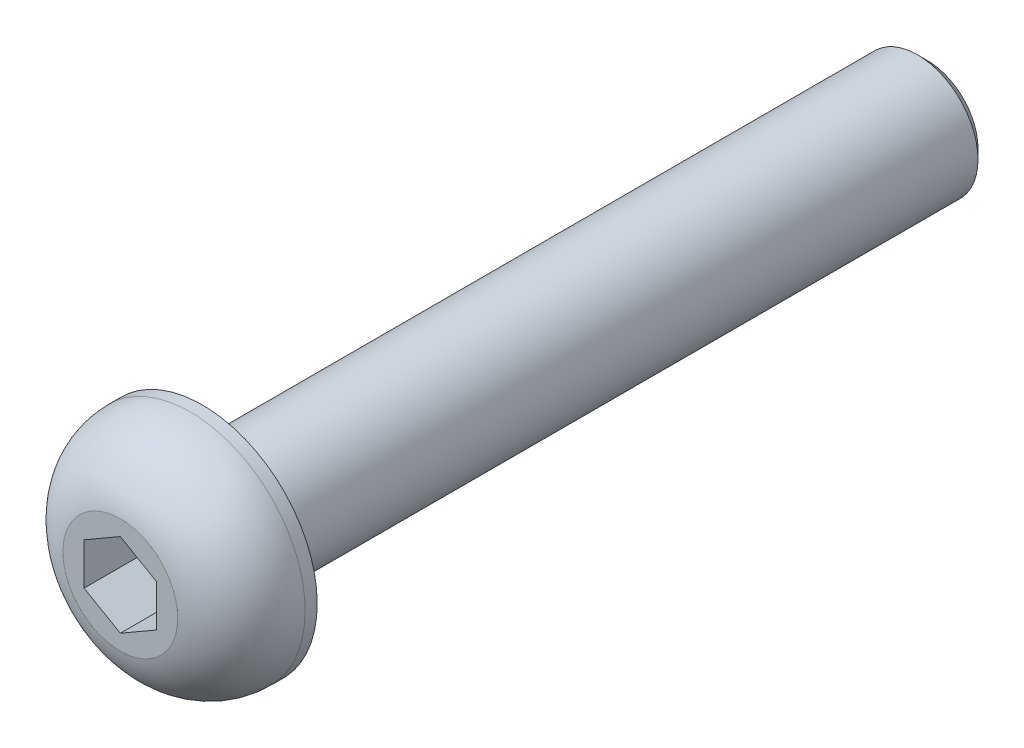
ISO-10303-21;
HEADER;
FILE_DESCRIPTION(('STEP AP214'),'2;1');
FILE_NAME('part.step','',(''),(''),'','','');
FILE_SCHEMA(('AUTOMOTIVE_DESIGN { 1 0 10303 214 1 1 1 1 }'));
ENDSEC;
DATA;
#1=APPLICATION_CONTEXT('core data for automotive mechanical design processes');
#2=APPLICATION_PROTOCOL_DEFINITION('international standard','automotive_design',2000,#1);
#3=PRODUCT_CONTEXT('',#1,'mechanical');
#4=PRODUCT('Part','Part','',(#3));
#5=PRODUCT_RELATED_PRODUCT_CATEGORY('part','',(#4));
#6=PRODUCT_DEFINITION_FORMATION('','',#4);
#7=PRODUCT_DEFINITION_CONTEXT('part definition',#1,'design');
#8=PRODUCT_DEFINITION('design','',#6,#7);
#9=PRODUCT_DEFINITION_SHAPE('','',#8);
#10=(LENGTH_UNIT() NAMED_UNIT(*) SI_UNIT(.MILLI.,.METRE.));
#11=(NAMED_UNIT(*) PLANE_ANGLE_UNIT() SI_UNIT($,.RADIAN.));
#12=(NAMED_UNIT(*) SI_UNIT($,.STERADIAN.) SOLID_ANGLE_UNIT());
#13=UNCERTAINTY_MEASURE_WITH_UNIT(LENGTH_MEASURE(1.E-05),#10,'distance_accuracy_value','');
#14=(GEOMETRIC_REPRESENTATION_CONTEXT(3) GLOBAL_UNCERTAINTY_ASSIGNED_CONTEXT((#13)) GLOBAL_UNIT_ASSIGNED_CONTEXT((#10,
#11,#12)) REPRESENTATION_CONTEXT('',''));
#15=CARTESIAN_POINT('',(0.,0.,0.));
#16=DIRECTION('',(0.,0.,1.));
#17=DIRECTION('',(1.,0.,0.));
#18=AXIS2_PLACEMENT_3D('',#15,#16,#17);
#19=CARTESIAN_POINT('',(0.,2.375,3.4));
#20=DIRECTION('',(0.,0.,-1.));
#21=DIRECTION('',(-1.,0.,0.));
#22=AXIS2_PLACEMENT_3D('',#19,#20,#21);
#23=PLANE('',#22);
#24=CARTESIAN_POINT('',(0.,0.,3.4));
#25=DIRECTION('',(0.,0.,1.));
#26=DIRECTION('',(1.,0.,0.));
#27=AXIS2_PLACEMENT_3D('',#24,#25,#26);
#28=CIRCLE('',#27,2.375);
#29=CARTESIAN_POINT('',(2.375,0.,3.4));
#30=VERTEX_POINT('',#29);
#31=EDGE_CURVE('E140',#30,#30,#28,.T.);
#32=ORIENTED_EDGE('',*,*,#31,.T.);
#33=EDGE_LOOP('',(#32));
#34=FACE_BOUND('',#33,.T.);
#35=DIRECTION('',(-0.866025403784439,-0.5,0.));
#36=VECTOR('',#35,1.);
#37=CARTESIAN_POINT('',(0.,1.73205080756888,3.4));
#38=LINE('',#37,#36);
#39=CARTESIAN_POINT('',(0.,1.73205080756888,3.4));
#40=VERTEX_POINT('',#39);
#41=CARTESIAN_POINT('',(-1.5,0.866025403784438,3.4));
#42=VERTEX_POINT('',#41);
#43=EDGE_CURVE('E92',#40,#42,#38,.T.);
#44=ORIENTED_EDGE('',*,*,#43,.F.);
#45=DIRECTION('',(-0.866025403784439,0.5,0.));
#46=VECTOR('',#45,1.);
#47=CARTESIAN_POINT('',(1.5,0.866025403784439,3.4));
#48=LINE('',#47,#46);
#49=CARTESIAN_POINT('',(1.5,0.866025403784439,3.4));
#50=VERTEX_POINT('',#49);
#51=EDGE_CURVE('E52',#50,#40,#48,.T.);
#52=ORIENTED_EDGE('',*,*,#51,.F.);
#53=DIRECTION('',(0.,1.,0.));
#54=VECTOR('',#53,1.);
#55=CARTESIAN_POINT('',(1.5,-0.866025403784438,3.4));
#56=LINE('',#55,#54);
#57=CARTESIAN_POINT('',(1.5,-0.866025403784438,3.4));
#58=VERTEX_POINT('',#57);
#59=EDGE_CURVE('E120',#58,#50,#56,.T.);
#60=ORIENTED_EDGE('',*,*,#59,.F.);
#61=DIRECTION('',(0.866025403784438,0.5,0.));
#62=VECTOR('',#61,1.);
#63=CARTESIAN_POINT('',(0.,-1.73205080756888,3.4));
#64=LINE('',#63,#62);
#65=CARTESIAN_POINT('',(0.,-1.73205080756888,3.4));
#66=VERTEX_POINT('',#65);
#67=EDGE_CURVE('E114',#66,#58,#64,.T.);
#68=ORIENTED_EDGE('',*,*,#67,.F.);
#69=DIRECTION('',(0.866025403784439,-0.5,0.));
#70=VECTOR('',#69,1.);
#71=CARTESIAN_POINT('',(-1.5,-0.866025403784438,3.4));
#72=LINE('',#71,#70);
#73=CARTESIAN_POINT('',(-1.5,-0.866025403784438,3.4));
#74=VERTEX_POINT('',#73);
#75=EDGE_CURVE('E112',#74,#66,#72,.T.);
#76=ORIENTED_EDGE('',*,*,#75,.F.);
#77=DIRECTION('',(0.,-1.,0.));
#78=VECTOR('',#77,1.);
#79=CARTESIAN_POINT('',(-1.5,0.866025403784438,3.4));
#80=LINE('',#79,#78);
#81=EDGE_CURVE('E100',#42,#74,#80,.T.);
#82=ORIENTED_EDGE('',*,*,#81,.F.);
#83=EDGE_LOOP('',(#44,#52,#60,#68,#76,#82));
#84=FACE_BOUND('',#83,.T.);
#85=ADVANCED_FACE('F37',(#34,#84),#23,.F.);
#86=CARTESIAN_POINT('',(0.,0.,-30.));
#87=DIRECTION('',(0.,0.,1.));
#88=DIRECTION('',(1.,0.,0.));
#89=AXIS2_PLACEMENT_3D('',#86,#87,#88);
#90=PLANE('',#89);
#91=CARTESIAN_POINT('',(0.,0.,-30.));
#92=DIRECTION('',(0.,0.,1.));
#93=DIRECTION('',(1.,0.,0.));
#94=AXIS2_PLACEMENT_3D('',#91,#92,#93);
#95=CIRCLE('',#94,2.1);
#96=CARTESIAN_POINT('',(2.1,0.,-30.));
#97=VERTEX_POINT('',#96);
#98=EDGE_CURVE('E231',#97,#97,#95,.F.);
#99=ORIENTED_EDGE('',*,*,#98,.T.);
#100=EDGE_LOOP('',(#99));
#101=FACE_BOUND('',#100,.T.);
#102=ADVANCED_FACE('F209',(#101),#90,.F.);
#103=CARTESIAN_POINT('',(0.,0.,30.8099697885196));
#104=DIRECTION('',(0.,0.,1.));
#105=DIRECTION('',(1.,0.,0.));
#106=AXIS2_PLACEMENT_3D('',#103,#104,#105);
#107=CYLINDRICAL_SURFACE('',#106,2.5);
#108=CARTESIAN_POINT('',(0.,0.,-0.199999999999999));
#109=DIRECTION('',(0.,0.,1.));
#110=DIRECTION('',(1.,0.,0.));
#111=AXIS2_PLACEMENT_3D('',#108,#109,#110);
#112=CIRCLE('',#111,2.5);
#113=CARTESIAN_POINT('',(2.5,0.,-0.199999999999999));
#114=VERTEX_POINT('',#113);
#115=EDGE_CURVE('E11',#114,#114,#112,.F.);
#116=ORIENTED_EDGE('',*,*,#115,.T.);
#117=EDGE_LOOP('',(#116));
#118=FACE_BOUND('',#117,.T.);
#119=CARTESIAN_POINT('',(0.,0.,-29.6));
#120=DIRECTION('',(0.,0.,1.));
#121=DIRECTION('',(1.,0.,0.));
#122=AXIS2_PLACEMENT_3D('',#119,#120,#121);
#123=CIRCLE('',#122,2.5);
#124=CARTESIAN_POINT('',(2.5,0.,-29.6));
#125=VERTEX_POINT('',#124);
#126=EDGE_CURVE('E226',#125,#125,#123,.T.);
#127=ORIENTED_EDGE('',*,*,#126,.T.);
#128=EDGE_LOOP('',(#127));
#129=FACE_BOUND('',#128,.T.);
#130=ADVANCED_FACE('F214',(#118,#129),#107,.T.);
#131=CARTESIAN_POINT('',(0.,2.5,0.));
#132=DIRECTION('',(0.,0.,1.));
#133=DIRECTION('',(1.,0.,0.));
#134=AXIS2_PLACEMENT_3D('',#131,#132,#133);
#135=PLANE('',#134);
#136=CARTESIAN_POINT('',(0.,0.,0.));
#137=DIRECTION('',(0.,0.,1.));
#138=DIRECTION('',(1.,0.,0.));
#139=AXIS2_PLACEMENT_3D('',#136,#137,#138);
#140=CIRCLE('',#139,2.7);
#141=CARTESIAN_POINT('',(2.7,0.,0.));
#142=VERTEX_POINT('',#141);
#143=EDGE_CURVE('E45',#142,#142,#140,.T.);
#144=ORIENTED_EDGE('',*,*,#143,.T.);
#145=EDGE_LOOP('',(#144));
#146=FACE_BOUND('',#145,.T.);
#147=CARTESIAN_POINT('',(0.,0.,0.));
#148=DIRECTION('',(0.,0.,1.));
#149=DIRECTION('',(1.,0.,0.));
#150=AXIS2_PLACEMENT_3D('',#147,#148,#149);
#151=CIRCLE('',#150,4.75);
#152=CARTESIAN_POINT('',(4.75,0.,0.));
#153=VERTEX_POINT('',#152);
#154=EDGE_CURVE('E222',#153,#153,#151,.T.);
#155=ORIENTED_EDGE('',*,*,#154,.F.);
#156=EDGE_LOOP('',(#155));
#157=FACE_BOUND('',#156,.T.);
#158=ADVANCED_FACE('F236',(#146,#157),#135,.F.);
#159=CARTESIAN_POINT('',(0.,0.,30.8099697885196));
#160=DIRECTION('',(0.,0.,1.));
#161=DIRECTION('',(1.,0.,0.));
#162=AXIS2_PLACEMENT_3D('',#159,#160,#161);
#163=CYLINDRICAL_SURFACE('',#162,4.75);
#164=CARTESIAN_POINT('',(0.,0.,0.5));
#165=DIRECTION('',(0.,0.,1.));
#166=DIRECTION('',(1.,0.,0.));
#167=AXIS2_PLACEMENT_3D('',#164,#165,#166);
#168=CIRCLE('',#167,4.75);
#169=CARTESIAN_POINT('',(4.75,0.,0.5));
#170=VERTEX_POINT('',#169);
#171=EDGE_CURVE('E220',#170,#170,#168,.T.);
#172=ORIENTED_EDGE('',*,*,#171,.F.);
#173=EDGE_LOOP('',(#172));
#174=FACE_BOUND('',#173,.T.);
#175=ORIENTED_EDGE('',*,*,#154,.T.);
#176=EDGE_LOOP('',(#175));
#177=FACE_BOUND('',#176,.T.);
#178=ADVANCED_FACE('F258',(#174,#177),#163,.T.);
#179=CARTESIAN_POINT('',(0.,0.,0.499999999999999));
#180=DIRECTION('',(0.,0.,1.));
#181=DIRECTION('',(1.,0.,0.));
#182=AXIS2_PLACEMENT_3D('',#179,#180,#181);
#183=DEGENERATE_TOROIDAL_SURFACE('',#182,1.79197368421052,2.95802631578948,.T.);
#184=ORIENTED_EDGE('',*,*,#31,.F.);
#185=EDGE_LOOP('',(#184));
#186=FACE_BOUND('',#185,.T.);
#187=ORIENTED_EDGE('',*,*,#171,.T.);
#188=EDGE_LOOP('',(#187));
#189=FACE_BOUND('',#188,.T.);
#190=ADVANCED_FACE('F252',(#186,#189),#183,.T.);
#191=CARTESIAN_POINT('',(0.,0.,-29.6));
#192=DIRECTION('',(0.,0.,1.));
#193=DIRECTION('',(1.,0.,0.));
#194=AXIS2_PLACEMENT_3D('',#191,#192,#193);
#195=CONICAL_SURFACE('',#194,2.5,0.785398163397446);
#196=ORIENTED_EDGE('',*,*,#98,.F.);
#197=EDGE_LOOP('',(#196));
#198=FACE_BOUND('',#197,.T.);
#199=ORIENTED_EDGE('',*,*,#126,.F.);
#200=EDGE_LOOP('',(#199));
#201=FACE_BOUND('',#200,.T.);
#202=ADVANCED_FACE('F250',(#198,#201),#195,.T.);
#203=CARTESIAN_POINT('',(1.5,0.866025403784439,-30.001));
#204=DIRECTION('',(0.5,0.866025403784439,0.));
#205=DIRECTION('',(-0.866025403784439,0.5,0.));
#206=AXIS2_PLACEMENT_3D('',#203,#204,#205);
#207=PLANE('',#206);
#208=CARTESIAN_POINT('',(-0.000199999999999678,1.73216627762271,1.13404126954845));
#209=CARTESIAN_POINT('',(0.0657192911025481,1.69410775715987,1.11205745276918));
#210=CARTESIAN_POINT('',(0.132207589122235,1.65572072040024,1.09206348568182));
#211=CARTESIAN_POINT('',(0.266335660665071,1.5782818421891,1.05716269718451));
#212=CARTESIAN_POINT('',(0.333977818646887,1.53922862406973,1.04226822432317));
#213=CARTESIAN_POINT('',(0.468423777869844,1.4616062133209,1.01908127731024));
#214=CARTESIAN_POINT('',(0.535206884927249,1.42304896848399,1.01063450771181));
#215=CARTESIAN_POINT('',(0.669087568389882,1.34575291984755,1.00054817351185));
#216=CARTESIAN_POINT('',(0.73618465770438,1.30701439726998,0.998900259357891));
#217=CARTESIAN_POINT('',(0.861574731829197,1.23462040422031,1.0023162190531));
#218=CARTESIAN_POINT('',(0.919886423219821,1.20095413349903,1.00654135522398));
#219=CARTESIAN_POINT('',(1.03612987953878,1.13384094270175,1.01993637143267));
#220=CARTESIAN_POINT('',(1.09406124196879,1.10039425500826,1.02911083361585));
#221=CARTESIAN_POINT('',(1.21054465133915,1.03314252725216,1.052047779955));
#222=CARTESIAN_POINT('',(1.26908194454669,0.999346005261151,1.06590755816145));
#223=CARTESIAN_POINT('',(1.38528312338636,0.932257223377917,1.09736438023666));
#224=CARTESIAN_POINT('',(1.44294849940381,0.898964103011321,1.11495402588962));
#225=CARTESIAN_POINT('',(1.5002,0.865909933730601,1.13404126954845));
#226=B_SPLINE_CURVE_WITH_KNOTS('',3,(#208,#209,#210,#211,#212,#213,#214,#215,#216,#217,#218,
#219,#220,#221,#222,#223,#224,#225),.UNSPECIFIED.,.F.,.F.,(4,2,2,2,2,2,2,2,4),(0.,
0.237777822177384,0.47612742284192,0.708577067230591,0.940741159251582,1.14294352835891,
1.34533342091875,1.55221450553907,1.75868901573748),.UNSPECIFIED.);
#227=CARTESIAN_POINT('',(0.,1.73205080756888,1.13397459621556));
#228=VERTEX_POINT('',#227);
#229=CARTESIAN_POINT('',(1.5,0.866025403784439,1.13397459621556));
#230=VERTEX_POINT('',#229);
#231=EDGE_CURVE('E141',#228,#230,#226,.T.);
#232=ORIENTED_EDGE('',*,*,#231,.T.);
#233=DIRECTION('',(0.,0.,1.));
#234=VECTOR('',#233,1.);
#235=CARTESIAN_POINT('',(1.5,0.866025403784439,-30.001));
#236=LINE('',#235,#234);
#237=EDGE_CURVE('E122',#230,#50,#236,.T.);
#238=ORIENTED_EDGE('',*,*,#237,.T.);
#239=ORIENTED_EDGE('',*,*,#51,.T.);
#240=DIRECTION('',(0.,0.,1.));
#241=VECTOR('',#240,1.);
#242=CARTESIAN_POINT('',(0.,1.73205080756888,-30.001));
#243=LINE('',#242,#241);
#244=EDGE_CURVE('E97',#228,#40,#243,.T.);
#245=ORIENTED_EDGE('',*,*,#244,.F.);
#246=EDGE_LOOP('',(#232,#238,#239,#245));
#247=FACE_BOUND('',#246,.T.);
#248=ADVANCED_FACE('F151',(#247),#207,.F.);
#249=CARTESIAN_POINT('',(1.5,-0.866025403784438,-30.001));
#250=DIRECTION('',(1.,0.,0.));
#251=DIRECTION('',(0.,1.,0.));
#252=AXIS2_PLACEMENT_3D('',#249,#250,#251);
#253=PLANE('',#252);
#254=CARTESIAN_POINT('',(1.5,-2.37874877868409,1.75759665323203));
#255=CARTESIAN_POINT('',(1.5,-2.31274574502044,1.72537160492485));
#256=CARTESIAN_POINT('',(1.5,-2.24659666013007,1.69344083131604));
#257=CARTESIAN_POINT('',(1.5,-2.11392884782338,1.63033245608343));
#258=CARTESIAN_POINT('',(1.5,-2.04741006838187,1.59915496394457));
#259=CARTESIAN_POINT('',(1.5,-1.91360751694505,1.53757215136867));
#260=CARTESIAN_POINT('',(1.5,-1.84632157835343,1.50717152292928));
#261=CARTESIAN_POINT('',(1.5,-1.71123224774828,1.44754705704895));
#262=CARTESIAN_POINT('',(1.5,-1.64342887898006,1.41832316710951));
#263=CARTESIAN_POINT('',(1.5,-1.50487114211733,1.36038888038743));
#264=CARTESIAN_POINT('',(1.5,-1.43409507585528,1.33173010789239));
#265=CARTESIAN_POINT('',(1.5,-1.2917483015657,1.27646281245522));
#266=CARTESIAN_POINT('',(1.5,-1.22017766117702,1.2498541165065));
#267=CARTESIAN_POINT('',(1.5,-1.07622501054223,1.19933823991993));
#268=CARTESIAN_POINT('',(1.5,-1.00384469305776,1.17542628177461));
#269=CARTESIAN_POINT('',(1.5,-0.858047452698781,1.13103890364063));
#270=CARTESIAN_POINT('',(1.5,-0.784630847150789,1.11056245537912));
#271=CARTESIAN_POINT('',(1.5,-0.637106765977147,1.0740972559044));
#272=CARTESIAN_POINT('',(1.5,-0.563005435987777,1.05808408778549));
#273=CARTESIAN_POINT('',(1.5,-0.413830143693647,1.03142192462866));
#274=CARTESIAN_POINT('',(1.5,-0.33875630129043,1.02077227465615));
#275=CARTESIAN_POINT('',(1.5,-0.189006040097561,1.00582523758463));
#276=CARTESIAN_POINT('',(1.5,-0.114338404690483,1.0014423232251));
#277=CARTESIAN_POINT('',(1.5,0.035097513669746,0.999161779875737));
#278=CARTESIAN_POINT('',(1.5,0.109865799731961,1.00126435603912));
#279=CARTESIAN_POINT('',(1.5,0.286095689598936,1.01368949202895));
#280=CARTESIAN_POINT('',(1.5,0.387367328373921,1.02672550290978));
#281=CARTESIAN_POINT('',(1.5,0.588195456312349,1.06255311121105));
#282=CARTESIAN_POINT('',(1.5,0.687750028982992,1.08535495747343));
#283=CARTESIAN_POINT('',(1.5,0.836816450941095,1.12531444011054));
#284=CARTESIAN_POINT('',(1.5,0.887073280800136,1.13980777431215));
#285=CARTESIAN_POINT('',(1.5,0.987067327855988,1.17039532179613));
#286=CARTESIAN_POINT('',(1.5,1.03680482900076,1.18648860351975));
#287=CARTESIAN_POINT('',(1.5,1.13582038517206,1.2200193186232));
#288=CARTESIAN_POINT('',(1.5,1.1850984463968,1.23745673384009));
#289=CARTESIAN_POINT('',(1.5,1.28324593886576,1.27346102756484));
#290=CARTESIAN_POINT('',(1.5,1.33211531537388,1.29202805469345));
#291=CARTESIAN_POINT('',(1.5,1.49440566438627,1.35547975652815));
#292=CARTESIAN_POINT('',(1.5,1.60701277223779,1.402445250974));
#293=CARTESIAN_POINT('',(1.5,1.83075302149775,1.49978016475535));
#294=CARTESIAN_POINT('',(1.5,1.94188581099527,1.55015037989139));
#295=CARTESIAN_POINT('',(1.5,2.16311574833764,1.65327366353819));
#296=CARTESIAN_POINT('',(1.5,2.27321224673675,1.70602811986459));
#297=CARTESIAN_POINT('',(1.5,2.49258510502557,1.81321950035594));
#298=CARTESIAN_POINT('',(1.5,2.60186142786115,1.86765649997343));
#299=CARTESIAN_POINT('',(1.5,2.92929969008695,2.03305140834138));
#300=CARTESIAN_POINT('',(1.5,3.14653602298829,2.14583782126264));
#301=CARTESIAN_POINT('',(1.5,3.57945631818397,2.37412943553697));
#302=CARTESIAN_POINT('',(1.5,3.79514084212188,2.48963358117076));
#303=CARTESIAN_POINT('',(1.5,4.19416669408602,2.70541439387798));
#304=CARTESIAN_POINT('',(1.5,4.37763617108744,2.80545434459614));
#305=CARTESIAN_POINT('',(1.5,4.74410282064929,3.00644416922784));
#306=CARTESIAN_POINT('',(1.5,4.92709993621561,3.10739414689505));
#307=CARTESIAN_POINT('',(1.5,5.29191078057049,3.30948937221621));
#308=CARTESIAN_POINT('',(1.5,5.47372612938883,3.41063169806351));
#309=CARTESIAN_POINT('',(1.5,5.83705821615903,3.61339728699118));
#310=CARTESIAN_POINT('',(1.5,6.01857498914784,3.71502048726914));
#311=CARTESIAN_POINT('',(1.5,6.19999510741632,3.81681495532188));
#312=B_SPLINE_CURVE_WITH_KNOTS('',3,(#254,#255,#256,#257,#258,#259,#260,#261,#262,#263,#264,
#265,#266,#267,#268,#269,#270,#271,#272,#273,#274,#275,#276,#277,#278,#279,#280,#281,#282,#283,
#284,#285,#286,#287,#288,#289,#290,#291,#292,#293,#294,#295,#296,#297,#298,#299,#300,#301,#302,
#303,#304,#305,#306,#307,#308,#309,#310,#311),.UNSPECIFIED.,.F.,.F.,(4,2,2,2,2,2,2,2,2,2,2,2,2,
2,2,2,2,2,2,2,2,2,2,2,2,2,2,2,4),(0.,0.220351468140766,0.44073477269315,0.662230491180661,
0.883716316980751,1.11276649608326,1.34179732435009,1.57041580992587,1.79896574579805,
2.02623966904286,2.25348583333163,2.47759997074845,2.70172119756067,3.00742120849379,
3.31344282815401,3.47033697782919,3.62714030606318,3.78394151582572,3.94076340040727,
4.30669011496381,4.67270265694945,5.03893106221478,5.4051759146467,6.13944337782784,
6.87343017182309,7.5003405818442,8.12732339442968,8.75148543497969,9.37556809355048),.UNSPECIFIED.);
#313=CARTESIAN_POINT('',(1.5,-0.866025403784438,1.13397459621556));
#314=VERTEX_POINT('',#313);
#315=EDGE_CURVE('E180',#230,#314,#312,.F.);
#316=ORIENTED_EDGE('',*,*,#315,.T.);
#317=DIRECTION('',(0.,0.,1.));
#318=VECTOR('',#317,1.);
#319=CARTESIAN_POINT('',(1.5,-0.866025403784438,-30.001));
#320=LINE('',#319,#318);
#321=EDGE_CURVE('E124',#314,#58,#320,.T.);
#322=ORIENTED_EDGE('',*,*,#321,.T.);
#323=ORIENTED_EDGE('',*,*,#59,.T.);
#324=ORIENTED_EDGE('',*,*,#237,.F.);
#325=EDGE_LOOP('',(#316,#322,#323,#324));
#326=FACE_BOUND('',#325,.T.);
#327=ADVANCED_FACE('F191',(#326),#253,.F.);
#328=CARTESIAN_POINT('',(0.,-1.73205080756888,-30.001));
#329=DIRECTION('',(0.5,-0.866025403784438,0.));
#330=DIRECTION('',(0.866025403784439,0.5,0.));
#331=AXIS2_PLACEMENT_3D('',#328,#329,#330);
#332=PLANE('',#331);
#333=CARTESIAN_POINT('',(1.5002,-0.8659099337306,1.13404126954845));
#334=CARTESIAN_POINT('',(1.43428070889745,-0.903968454193445,1.11205745276918));
#335=CARTESIAN_POINT('',(1.36779241087776,-0.942355490953072,1.09206348568182));
#336=CARTESIAN_POINT('',(1.23366433933493,-1.01979436916421,1.05716269718451));
#337=CARTESIAN_POINT('',(1.16602218135311,-1.05884758728358,1.04226822432317));
#338=CARTESIAN_POINT('',(1.03157622213016,-1.13646999803241,1.01908127731024));
#339=CARTESIAN_POINT('',(0.964793115072751,-1.17502724286933,1.01063450771181));
#340=CARTESIAN_POINT('',(0.830912431610118,-1.25232329150577,1.00054817351185));
#341=CARTESIAN_POINT('',(0.76381534229562,-1.29106181408333,0.998900259357891));
#342=CARTESIAN_POINT('',(0.638425268170803,-1.363455807133,1.0023162190531));
#343=CARTESIAN_POINT('',(0.580113576780179,-1.39712207785428,1.00654135522398));
#344=CARTESIAN_POINT('',(0.463870120461217,-1.46423526865157,1.01993637143267));
#345=CARTESIAN_POINT('',(0.405938758031214,-1.49768195634505,1.02911083361585));
#346=CARTESIAN_POINT('',(0.289455348660848,-1.56493368410116,1.052047779955));
#347=CARTESIAN_POINT('',(0.230918055453308,-1.59873020609216,1.06590755816145));
#348=CARTESIAN_POINT('',(0.114716876613641,-1.6658189879754,1.09736438023666));
#349=CARTESIAN_POINT('',(0.0570515005961903,-1.69911210834199,1.11495402588962));
#350=CARTESIAN_POINT('',(-0.000199999999999073,-1.73216627762271,1.13404126954845));
#351=B_SPLINE_CURVE_WITH_KNOTS('',3,(#333,#334,#335,#336,#337,#338,#339,#340,#341,#342,#343,
#344,#345,#346,#347,#348,#349,#350),.UNSPECIFIED.,.F.,.F.,(4,2,2,2,2,2,2,2,4),(0.,
0.237777822177384,0.47612742284192,0.708577067230591,0.940741159251582,1.14294352835891,
1.34533342091876,1.55221450553907,1.75868901573748),.UNSPECIFIED.);
#352=CARTESIAN_POINT('',(0.,-1.73205080756888,1.13397459621556));
#353=VERTEX_POINT('',#352);
#354=EDGE_CURVE('E173',#314,#353,#351,.T.);
#355=ORIENTED_EDGE('',*,*,#354,.T.);
#356=DIRECTION('',(0.,0.,1.));
#357=VECTOR('',#356,1.);
#358=CARTESIAN_POINT('',(0.,-1.73205080756888,-30.001));
#359=LINE('',#358,#357);
#360=EDGE_CURVE('E127',#353,#66,#359,.T.);
#361=ORIENTED_EDGE('',*,*,#360,.T.);
#362=ORIENTED_EDGE('',*,*,#67,.T.);
#363=ORIENTED_EDGE('',*,*,#321,.F.);
#364=EDGE_LOOP('',(#355,#361,#362,#363));
#365=FACE_BOUND('',#364,.T.);
#366=ADVANCED_FACE('F194',(#365),#332,.F.);
#367=CARTESIAN_POINT('',(-1.5,-0.866025403784438,-30.001));
#368=DIRECTION('',(-0.499999999999999,-0.866025403784439,0.));
#369=DIRECTION('',(0.866025403784439,-0.5,0.));
#370=AXIS2_PLACEMENT_3D('',#367,#368,#369);
#371=PLANE('',#370);
#372=CARTESIAN_POINT('',(0.000200000000000867,-1.73216627762271,1.13404126954845));
#373=CARTESIAN_POINT('',(-0.0657192911025468,-1.69410775715987,1.11205745276918));
#374=CARTESIAN_POINT('',(-0.132207589122234,-1.65572072040024,1.09206348568182));
#375=CARTESIAN_POINT('',(-0.26633566066507,-1.5782818421891,1.05716269718451));
#376=CARTESIAN_POINT('',(-0.333977818646886,-1.53922862406973,1.04226822432317));
#377=CARTESIAN_POINT('',(-0.468423777869843,-1.4616062133209,1.01908127731024));
#378=CARTESIAN_POINT('',(-0.535206884927248,-1.42304896848399,1.01063450771181));
#379=CARTESIAN_POINT('',(-0.66908756838988,-1.34575291984755,1.00054817351185));
#380=CARTESIAN_POINT('',(-0.736184657704379,-1.30701439726998,0.998900259357891));
#381=CARTESIAN_POINT('',(-0.861574731829196,-1.23462040422031,1.0023162190531));
#382=CARTESIAN_POINT('',(-0.91988642321982,-1.20095413349903,1.00654135522398));
#383=CARTESIAN_POINT('',(-1.03612987953878,-1.13384094270175,1.01993637143267));
#384=CARTESIAN_POINT('',(-1.09406124196879,-1.10039425500826,1.02911083361585));
#385=CARTESIAN_POINT('',(-1.21054465133915,-1.03314252725216,1.052047779955));
#386=CARTESIAN_POINT('',(-1.26908194454669,-0.99934600526115,1.06590755816145));
#387=CARTESIAN_POINT('',(-1.38528312338636,-0.932257223377916,1.09736438023666));
#388=CARTESIAN_POINT('',(-1.44294849940381,-0.89896410301132,1.11495402588962));
#389=CARTESIAN_POINT('',(-1.5002,-0.8659099337306,1.13404126954845));
#390=B_SPLINE_CURVE_WITH_KNOTS('',3,(#372,#373,#374,#375,#376,#377,#378,#379,#380,#381,#382,
#383,#384,#385,#386,#387,#388,#389),.UNSPECIFIED.,.F.,.F.,(4,2,2,2,2,2,2,2,4),(0.,
0.237777822177384,0.47612742284192,0.708577067230591,0.940741159251581,1.14294352835891,
1.34533342091876,1.55221450553907,1.75868901573748),.UNSPECIFIED.);
#391=CARTESIAN_POINT('',(-1.5,-0.866025403784475,1.13397459621554));
#392=VERTEX_POINT('',#391);
#393=EDGE_CURVE('E166',#353,#392,#390,.T.);
#394=ORIENTED_EDGE('',*,*,#393,.T.);
#395=DIRECTION('',(0.,0.,1.));
#396=VECTOR('',#395,1.);
#397=CARTESIAN_POINT('',(-1.5,-0.866025403784438,-30.001));
#398=LINE('',#397,#396);
#399=EDGE_CURVE('E108',#392,#74,#398,.T.);
#400=ORIENTED_EDGE('',*,*,#399,.T.);
#401=ORIENTED_EDGE('',*,*,#75,.T.);
#402=ORIENTED_EDGE('',*,*,#360,.F.);
#403=EDGE_LOOP('',(#394,#400,#401,#402));
#404=FACE_BOUND('',#403,.T.);
#405=ADVANCED_FACE('F198',(#404),#371,.F.);
#406=CARTESIAN_POINT('',(-1.5,0.866025403784438,-30.001));
#407=DIRECTION('',(-1.,0.,0.));
#408=DIRECTION('',(0.,0.,1.));
#409=AXIS2_PLACEMENT_3D('',#406,#407,#408);
#410=PLANE('',#409);
#411=CARTESIAN_POINT('',(-1.5,-2.37874877486364,1.75759665136626));
#412=CARTESIAN_POINT('',(-1.5,-2.31274574132915,1.72537160313687));
#413=CARTESIAN_POINT('',(-1.5,-2.24659665656804,1.69344082960579));
#414=CARTESIAN_POINT('',(-1.5,-2.11392884452025,1.63033245452826));
#415=CARTESIAN_POINT('',(-1.5,-2.04741006520838,1.59915496246675));
#416=CARTESIAN_POINT('',(-1.5,-1.91360751403276,1.53757215004554));
#417=CARTESIAN_POINT('',(-1.5,-1.84632157557268,1.5071715216835));
#418=CARTESIAN_POINT('',(-1.5,-1.71123224523151,1.44754705595659));
#419=CARTESIAN_POINT('',(-1.5,-1.64342887659572,1.41832316609321));
#420=CARTESIAN_POINT('',(-1.5,-1.50487114000789,1.36038887952544));
#421=CARTESIAN_POINT('',(-1.5,-1.43409507388839,1.33173010710848));
#422=CARTESIAN_POINT('',(-1.5,-1.2917482998861,1.27646281182335));
#423=CARTESIAN_POINT('',(-1.5,-1.22017765964215,1.2498541159486));
#424=CARTESIAN_POINT('',(-1.5,-1.07622500929951,1.19933823950309));
#425=CARTESIAN_POINT('',(-1.5,-1.00384469196246,1.17542628142486));
#426=CARTESIAN_POINT('',(-1.5,-0.85804745190227,1.13103890341441));
#427=CARTESIAN_POINT('',(-1.5,-0.784630846505657,1.11056245520934));
#428=CARTESIAN_POINT('',(-1.5,-0.637106765711287,1.07409725584894));
#429=CARTESIAN_POINT('',(-1.5,-0.563005435950861,1.05808408778374));
#430=CARTESIAN_POINT('',(-1.5,-0.413830144120324,1.03142192470009));
#431=CARTESIAN_POINT('',(-1.5,-0.338756301951752,1.02077227474707));
#432=CARTESIAN_POINT('',(-1.5,-0.189006041224555,1.0058252376726));
#433=CARTESIAN_POINT('',(-1.5,-0.11433840604845,1.0014423232914));
#434=CARTESIAN_POINT('',(-1.5,0.0350975118531223,0.999161779857832));
#435=CARTESIAN_POINT('',(-1.5,0.109865797687654,1.00126435595867));
#436=CARTESIAN_POINT('',(-1.5,0.286095687212982,1.01368949177416));
#437=CARTESIAN_POINT('',(-1.5,0.387367325875981,1.02672550255037));
#438=CARTESIAN_POINT('',(-1.5,0.588195453599218,1.06255311064005));
#439=CARTESIAN_POINT('',(-1.5,0.68775002616667,1.08535495679545));
#440=CARTESIAN_POINT('',(-1.5,0.836816447969716,1.12531443927462));
#441=CARTESIAN_POINT('',(-1.5,0.88707327777543,1.13980777342304));
#442=CARTESIAN_POINT('',(-1.5,0.987067324725341,1.17039532080236));
#443=CARTESIAN_POINT('',(-1.5,1.0368048258175,1.18648860247452));
#444=CARTESIAN_POINT('',(-1.5,1.13582038188398,1.22001931747695));
#445=CARTESIAN_POINT('',(-1.5,1.1850984430565,1.23745673264429));
#446=CARTESIAN_POINT('',(-1.5,1.28324593542101,1.27346102627171));
#447=CARTESIAN_POINT('',(-1.5,1.3321153118769,1.29202805335254));
#448=CARTESIAN_POINT('',(-1.5,1.49440566056735,1.35547975497309));
#449=CARTESIAN_POINT('',(-1.5,1.60701276815143,1.40244524924972));
#450=CARTESIAN_POINT('',(-1.5,1.83075301687818,1.49978016269251));
#451=CARTESIAN_POINT('',(-1.5,1.94188580610994,1.55015037765921));
#452=CARTESIAN_POINT('',(-1.5,2.16311574292137,1.65327366096842));
#453=CARTESIAN_POINT('',(-1.5,2.2732122410553,1.70602811712657));
#454=CARTESIAN_POINT('',(-1.5,2.49258509881367,1.81321949728282));
#455=CARTESIAN_POINT('',(-1.5,2.60186142138398,1.86765649673345));
#456=CARTESIAN_POINT('',(-1.5,2.92929968281435,2.03305140460314));
#457=CARTESIAN_POINT('',(-1.5,3.14653601518501,2.14583781719508));
#458=CARTESIAN_POINT('',(-1.5,3.57945630931752,2.37412943081493));
#459=CARTESIAN_POINT('',(-1.5,3.79514083272295,2.48963357612355));
#460=CARTESIAN_POINT('',(-1.5,4.19416668373965,2.70541438825285));
#461=CARTESIAN_POINT('',(-1.5,4.37763616032614,2.80545433871814));
#462=CARTESIAN_POINT('',(-1.5,4.74410280905717,3.0064441628461));
#463=CARTESIAN_POINT('',(-1.5,4.9270999242076,3.10739414026244));
#464=CARTESIAN_POINT('',(-1.5,5.29191076772769,3.30948936508216));
#465=CARTESIAN_POINT('',(-1.5,5.47372611612712,3.41063169067887));
#466=CARTESIAN_POINT('',(-1.5,5.8370582020589,3.61339727910642));
#467=CARTESIAN_POINT('',(-1.5,6.01857497462819,3.71502047913487));
#468=CARTESIAN_POINT('',(-1.5,6.19999509247694,3.81681494693849));
#469=B_SPLINE_CURVE_WITH_KNOTS('',3,(#411,#412,#413,#414,#415,#416,#417,#418,#419,#420,#421,
#422,#423,#424,#425,#426,#427,#428,#429,#430,#431,#432,#433,#434,#435,#436,#437,#438,#439,#440,
#441,#442,#443,#444,#445,#446,#447,#448,#449,#450,#451,#452,#453,#454,#455,#456,#457,#458,#459,
#460,#461,#462,#463,#464,#465,#466,#467,#468),.UNSPECIFIED.,.F.,.F.,(4,2,2,2,2,2,2,2,2,2,2,2,2,
2,2,2,2,2,2,2,2,2,2,2,2,2,2,2,4),(0.,0.220351467690176,0.440734771791907,0.66223048982423,
0.883716315169167,1.1127664937874,1.34179732157003,1.57041580666299,1.79896574205271,
2.02623966459362,2.25348582817953,2.47759996491114,2.70172119103782,3.0074212015981,
3.31344282088424,3.4703369703614,3.62714029839762,3.78394150796283,3.94076339234695,
4.30669010596745,4.67270264701708,5.0389310513468,5.40517590284316,6.13944336415589,
6.87343015628234,7.50034056484735,8.12732337597685,8.75148541506317,9.37556807217012),.UNSPECIFIED.);
#470=CARTESIAN_POINT('',(-1.5,0.866025403784438,1.13397459621556));
#471=VERTEX_POINT('',#470);
#472=EDGE_CURVE('E107',#392,#471,#469,.T.);
#473=ORIENTED_EDGE('',*,*,#472,.T.);
#474=DIRECTION('',(0.,0.,1.));
#475=VECTOR('',#474,1.);
#476=CARTESIAN_POINT('',(-1.5,0.866025403784438,-30.001));
#477=LINE('',#476,#475);
#478=EDGE_CURVE('E96',#471,#42,#477,.T.);
#479=ORIENTED_EDGE('',*,*,#478,.T.);
#480=ORIENTED_EDGE('',*,*,#81,.T.);
#481=ORIENTED_EDGE('',*,*,#399,.F.);
#482=EDGE_LOOP('',(#473,#479,#480,#481));
#483=FACE_BOUND('',#482,.T.);
#484=ADVANCED_FACE('F104',(#483),#410,.F.);
#485=CARTESIAN_POINT('',(0.,1.73205080756888,-30.001));
#486=DIRECTION('',(-0.5,0.866025403784439,0.));
#487=DIRECTION('',(-0.866025403784439,-0.5,0.));
#488=AXIS2_PLACEMENT_3D('',#485,#486,#487);
#489=PLANE('',#488);
#490=CARTESIAN_POINT('',(-1.5002,0.8659099337306,1.13404126954845));
#491=CARTESIAN_POINT('',(-1.43428070889745,0.903968454193445,1.11205745276918));
#492=CARTESIAN_POINT('',(-1.36779241087777,0.942355490953071,1.09206348568182));
#493=CARTESIAN_POINT('',(-1.23366433933493,1.01979436916421,1.05716269718451));
#494=CARTESIAN_POINT('',(-1.16602218135311,1.05884758728358,1.04226822432317));
#495=CARTESIAN_POINT('',(-1.03157622213016,1.13646999803241,1.01908127731024));
#496=CARTESIAN_POINT('',(-0.964793115072751,1.17502724286933,1.01063450771181));
#497=CARTESIAN_POINT('',(-0.830912431610119,1.25232329150577,1.00054817351185));
#498=CARTESIAN_POINT('',(-0.763815342295621,1.29106181408333,0.998900259357891));
#499=CARTESIAN_POINT('',(-0.638425268170804,1.363455807133,1.0023162190531));
#500=CARTESIAN_POINT('',(-0.58011357678018,1.39712207785428,1.00654135522398));
#501=CARTESIAN_POINT('',(-0.463870120461216,1.46423526865157,1.01993637143267));
#502=CARTESIAN_POINT('',(-0.405938758031214,1.49768195634505,1.02911083361585));
#503=CARTESIAN_POINT('',(-0.289455348660847,1.56493368410116,1.052047779955));
#504=CARTESIAN_POINT('',(-0.230918055453307,1.59873020609216,1.06590755816145));
#505=CARTESIAN_POINT('',(-0.114716876613639,1.6658189879754,1.09736438023666));
#506=CARTESIAN_POINT('',(-0.0570515005961889,1.69911210834199,1.11495402588962));
#507=CARTESIAN_POINT('',(0.000200000000000354,1.73216627762271,1.13404126954845));
#508=B_SPLINE_CURVE_WITH_KNOTS('',3,(#490,#491,#492,#493,#494,#495,#496,#497,#498,#499,#500,
#501,#502,#503,#504,#505,#506,#507),.UNSPECIFIED.,.F.,.F.,(4,2,2,2,2,2,2,2,4),(0.,
0.237777822177383,0.47612742284192,0.708577067230591,0.940741159251582,1.14294352835891,
1.34533342091876,1.55221450553907,1.75868901573748),.UNSPECIFIED.);
#509=EDGE_CURVE('E132',#471,#228,#508,.T.);
#510=ORIENTED_EDGE('',*,*,#509,.T.);
#511=ORIENTED_EDGE('',*,*,#244,.T.);
#512=ORIENTED_EDGE('',*,*,#43,.T.);
#513=ORIENTED_EDGE('',*,*,#478,.F.);
#514=EDGE_LOOP('',(#510,#511,#512,#513));
#515=FACE_BOUND('',#514,.T.);
#516=ADVANCED_FACE('F95',(#515),#489,.F.);
#517=CARTESIAN_POINT('',(0.,0.,0.133974596215552));
#518=DIRECTION('',(0.,0.,1.));
#519=DIRECTION('',(1.,0.,0.));
#520=AXIS2_PLACEMENT_3D('',#517,#518,#519);
#521=CONICAL_SURFACE('',#520,0.,1.04719755119659);
#522=ORIENTED_EDGE('',*,*,#354,.F.);
#523=ORIENTED_EDGE('',*,*,#315,.F.);
#524=ORIENTED_EDGE('',*,*,#231,.F.);
#525=ORIENTED_EDGE('',*,*,#509,.F.);
#526=ORIENTED_EDGE('',*,*,#472,.F.);
#527=ORIENTED_EDGE('',*,*,#393,.F.);
#528=EDGE_LOOP('',(#522,#523,#524,#525,#526,#527));
#529=FACE_BOUND('',#528,.T.);
#530=CARTESIAN_POINT('',(0.,0.,0.133974596215552));
#531=VERTEX_POINT('',#530);
#532=VERTEX_LOOP('',#531);
#533=FACE_BOUND('',#532,.T.);
#534=ADVANCED_FACE('F146',(#529,#533),#521,.F.);
#535=CARTESIAN_POINT('',(0.,0.,-0.199999999999999));
#536=DIRECTION('',(0.,0.,1.));
#537=DIRECTION('',(1.,0.,0.));
#538=AXIS2_PLACEMENT_3D('',#535,#536,#537);
#539=TOROIDAL_SURFACE('',#538,2.7,0.2);
#540=ORIENTED_EDGE('',*,*,#115,.F.);
#541=EDGE_LOOP('',(#540));
#542=FACE_BOUND('',#541,.T.);
#543=ORIENTED_EDGE('',*,*,#143,.F.);
#544=EDGE_LOOP('',(#543));
#545=FACE_BOUND('',#544,.T.);
#546=ADVANCED_FACE('F39',(#542,#545),#539,.F.);
#547=CLOSED_SHELL('',(#85,#102,#130,#158,#178,#190,#202,#248,#327,#366,#405,#484,#516,#534,#546));
#548=MANIFOLD_SOLID_BREP('B2',#547);
#549=ADVANCED_BREP_SHAPE_REPRESENTATION('',(#18,#548),#14);
#550=SHAPE_DEFINITION_REPRESENTATION(#9,#549);
ENDSEC;
END-ISO-10303-21;
